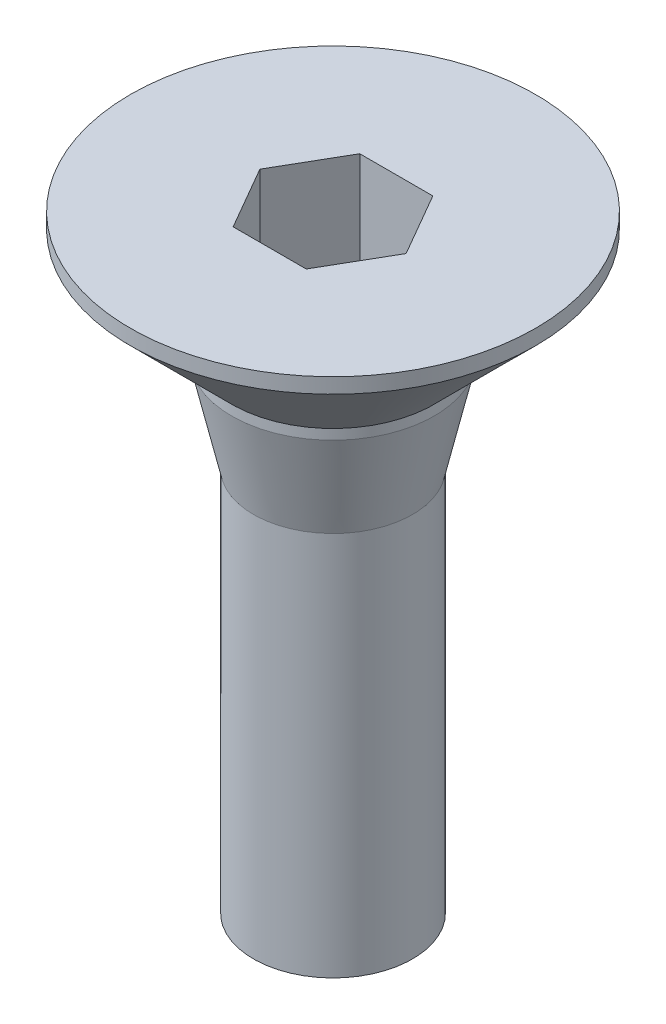
ISO-10303-21;
HEADER;
FILE_DESCRIPTION(('STEP AP214'),'2;1');
FILE_NAME('part.step','',(''),(''),'','','');
FILE_SCHEMA(('AUTOMOTIVE_DESIGN { 1 0 10303 214 1 1 1 1 }'));
ENDSEC;
DATA;
#1=APPLICATION_CONTEXT('core data for automotive mechanical design processes');
#2=APPLICATION_PROTOCOL_DEFINITION('international standard','automotive_design',2000,#1);
#3=PRODUCT_CONTEXT('',#1,'mechanical');
#4=PRODUCT('Part','Part','',(#3));
#5=PRODUCT_RELATED_PRODUCT_CATEGORY('part','',(#4));
#6=PRODUCT_DEFINITION_FORMATION('','',#4);
#7=PRODUCT_DEFINITION_CONTEXT('part definition',#1,'design');
#8=PRODUCT_DEFINITION('design','',#6,#7);
#9=PRODUCT_DEFINITION_SHAPE('','',#8);
#10=(LENGTH_UNIT() NAMED_UNIT(*) SI_UNIT(.MILLI.,.METRE.));
#11=(NAMED_UNIT(*) PLANE_ANGLE_UNIT() SI_UNIT($,.RADIAN.));
#12=(NAMED_UNIT(*) SI_UNIT($,.STERADIAN.) SOLID_ANGLE_UNIT());
#13=UNCERTAINTY_MEASURE_WITH_UNIT(LENGTH_MEASURE(1.E-05),#10,'distance_accuracy_value','');
#14=(GEOMETRIC_REPRESENTATION_CONTEXT(3) GLOBAL_UNCERTAINTY_ASSIGNED_CONTEXT((#13)) GLOBAL_UNIT_ASSIGNED_CONTEXT((#10,
#11,#12)) REPRESENTATION_CONTEXT('',''));
#15=CARTESIAN_POINT('',(0.,0.,0.));
#16=DIRECTION('',(0.,0.,1.));
#17=DIRECTION('',(1.,0.,0.));
#18=AXIS2_PLACEMENT_3D('',#15,#16,#17);
#19=CARTESIAN_POINT('',(0.,0.,0.));
#20=DIRECTION('',(0.,-1.,0.));
#21=DIRECTION('',(1.,0.,0.));
#22=AXIS2_PLACEMENT_3D('',#19,#20,#21);
#23=PLANE('',#22);
#24=DIRECTION('',(1.,0.,0.));
#25=VECTOR('',#24,1.);
#26=CARTESIAN_POINT('',(-0.721687836487031,0.,1.25));
#27=LINE('',#26,#25);
#28=CARTESIAN_POINT('',(-0.721687836487031,0.,1.25));
#29=VERTEX_POINT('',#28);
#30=CARTESIAN_POINT('',(0.721687836487031,0.,1.25));
#31=VERTEX_POINT('',#30);
#32=EDGE_CURVE('E121',#29,#31,#27,.T.);
#33=ORIENTED_EDGE('',*,*,#32,.F.);
#34=DIRECTION('',(0.499999999999998,0.,0.86602540378444));
#35=VECTOR('',#34,1.);
#36=CARTESIAN_POINT('',(-0.721687836487031,0.,1.25));
#37=LINE('',#36,#35);
#38=CARTESIAN_POINT('',(-1.44337567297406,0.,0.));
#39=VERTEX_POINT('',#38);
#40=EDGE_CURVE('E47',#39,#29,#37,.T.);
#41=ORIENTED_EDGE('',*,*,#40,.F.);
#42=DIRECTION('',(-0.499999999999998,0.,0.86602540378444));
#43=VECTOR('',#42,1.);
#44=CARTESIAN_POINT('',(-0.721687836487031,0.,-1.25));
#45=LINE('',#44,#43);
#46=CARTESIAN_POINT('',(-0.721687836487031,0.,-1.25));
#47=VERTEX_POINT('',#46);
#48=EDGE_CURVE('E130',#47,#39,#45,.T.);
#49=ORIENTED_EDGE('',*,*,#48,.F.);
#50=DIRECTION('',(-1.,0.,0.));
#51=VECTOR('',#50,1.);
#52=CARTESIAN_POINT('',(-0.721687836487031,0.,-1.25));
#53=LINE('',#52,#51);
#54=CARTESIAN_POINT('',(0.721687836487031,0.,-1.25));
#55=VERTEX_POINT('',#54);
#56=EDGE_CURVE('E128',#55,#47,#53,.T.);
#57=ORIENTED_EDGE('',*,*,#56,.F.);
#58=DIRECTION('',(-0.499999999999998,0.,-0.86602540378444));
#59=VECTOR('',#58,1.);
#60=CARTESIAN_POINT('',(0.721687836487031,0.,-1.25));
#61=LINE('',#60,#59);
#62=CARTESIAN_POINT('',(1.44337567297406,0.,0.));
#63=VERTEX_POINT('',#62);
#64=EDGE_CURVE('E95',#63,#55,#61,.T.);
#65=ORIENTED_EDGE('',*,*,#64,.F.);
#66=DIRECTION('',(0.499999999999998,0.,-0.86602540378444));
#67=VECTOR('',#66,1.);
#68=CARTESIAN_POINT('',(0.721687836487031,0.,1.25));
#69=LINE('',#68,#67);
#70=EDGE_CURVE('E124',#31,#63,#69,.T.);
#71=ORIENTED_EDGE('',*,*,#70,.F.);
#72=EDGE_LOOP('',(#33,#41,#49,#57,#65,#71));
#73=FACE_BOUND('',#72,.T.);
#74=CARTESIAN_POINT('',(0.,0.,0.));
#75=DIRECTION('',(0.,1.,0.));
#76=DIRECTION('',(-1.,0.,0.));
#77=AXIS2_PLACEMENT_3D('',#74,#75,#76);
#78=CIRCLE('',#77,4.);
#79=CARTESIAN_POINT('',(-4.,0.,0.));
#80=VERTEX_POINT('',#79);
#81=EDGE_CURVE('E11',#80,#80,#78,.T.);
#82=ORIENTED_EDGE('',*,*,#81,.T.);
#83=EDGE_LOOP('',(#82));
#84=FACE_BOUND('',#83,.T.);
#85=ADVANCED_FACE('F33',(#73,#84),#23,.F.);
#86=CARTESIAN_POINT('',(0.,0.,0.));
#87=DIRECTION('',(0.,1.,0.));
#88=DIRECTION('',(-1.,0.,0.));
#89=AXIS2_PLACEMENT_3D('',#86,#87,#88);
#90=CYLINDRICAL_SURFACE('',#89,4.);
#91=ORIENTED_EDGE('',*,*,#81,.F.);
#92=EDGE_LOOP('',(#91));
#93=FACE_BOUND('',#92,.T.);
#94=CARTESIAN_POINT('',(0.,-0.299999999999975,0.));
#95=DIRECTION('',(0.,1.,0.));
#96=DIRECTION('',(-1.,0.,0.));
#97=AXIS2_PLACEMENT_3D('',#94,#95,#96);
#98=CIRCLE('',#97,4.);
#99=CARTESIAN_POINT('',(-4.,-0.299999999999976,0.));
#100=VERTEX_POINT('',#99);
#101=EDGE_CURVE('E40',#100,#100,#98,.T.);
#102=ORIENTED_EDGE('',*,*,#101,.T.);
#103=EDGE_LOOP('',(#102));
#104=FACE_BOUND('',#103,.T.);
#105=ADVANCED_FACE('F153',(#93,#104),#90,.T.);
#106=CARTESIAN_POINT('',(0.,-2.3,0.));
#107=DIRECTION('',(0.,1.,0.));
#108=DIRECTION('',(-1.,0.,0.));
#109=AXIS2_PLACEMENT_3D('',#106,#107,#108);
#110=CONICAL_SURFACE('',#109,2.,0.785398163397442);
#111=ORIENTED_EDGE('',*,*,#101,.F.);
#112=EDGE_LOOP('',(#111));
#113=FACE_BOUND('',#112,.T.);
#114=CARTESIAN_POINT('',(0.,-2.3,0.));
#115=DIRECTION('',(0.,1.,0.));
#116=DIRECTION('',(-1.,0.,0.));
#117=AXIS2_PLACEMENT_3D('',#114,#115,#116);
#118=CIRCLE('',#117,2.);
#119=CARTESIAN_POINT('',(-2.,-2.3,0.));
#120=VERTEX_POINT('',#119);
#121=EDGE_CURVE('E148',#120,#120,#118,.T.);
#122=ORIENTED_EDGE('',*,*,#121,.T.);
#123=EDGE_LOOP('',(#122));
#124=FACE_BOUND('',#123,.T.);
#125=ADVANCED_FACE('F155',(#113,#124),#110,.T.);
#126=CARTESIAN_POINT('',(0.,0.,0.));
#127=DIRECTION('',(0.,1.,0.));
#128=DIRECTION('',(-1.,0.,0.));
#129=AXIS2_PLACEMENT_3D('',#126,#127,#128);
#130=CYLINDRICAL_SURFACE('',#129,2.);
#131=ORIENTED_EDGE('',*,*,#121,.F.);
#132=EDGE_LOOP('',(#131));
#133=FACE_BOUND('',#132,.T.);
#134=CARTESIAN_POINT('',(0.,-2.5,0.));
#135=DIRECTION('',(0.,1.,0.));
#136=DIRECTION('',(-1.,0.,0.));
#137=AXIS2_PLACEMENT_3D('',#134,#135,#136);
#138=CIRCLE('',#137,2.);
#139=CARTESIAN_POINT('',(-2.,-2.5,0.));
#140=VERTEX_POINT('',#139);
#141=EDGE_CURVE('E145',#140,#140,#138,.T.);
#142=ORIENTED_EDGE('',*,*,#141,.T.);
#143=EDGE_LOOP('',(#142));
#144=FACE_BOUND('',#143,.T.);
#145=ADVANCED_FACE('F158',(#133,#144),#130,.T.);
#146=CARTESIAN_POINT('',(0.,-4.4,0.));
#147=DIRECTION('',(0.,1.,0.));
#148=DIRECTION('',(-1.,0.,0.));
#149=AXIS2_PLACEMENT_3D('',#146,#147,#148);
#150=CONICAL_SURFACE('',#149,1.5705,0.222316126094133);
#151=ORIENTED_EDGE('',*,*,#141,.F.);
#152=EDGE_LOOP('',(#151));
#153=FACE_BOUND('',#152,.T.);
#154=CARTESIAN_POINT('',(0.,-4.4,0.));
#155=DIRECTION('',(0.,1.,0.));
#156=DIRECTION('',(-1.,0.,0.));
#157=AXIS2_PLACEMENT_3D('',#154,#155,#156);
#158=CIRCLE('',#157,1.5705);
#159=CARTESIAN_POINT('',(-1.5705,-4.4,0.));
#160=VERTEX_POINT('',#159);
#161=EDGE_CURVE('E142',#160,#160,#158,.T.);
#162=ORIENTED_EDGE('',*,*,#161,.T.);
#163=EDGE_LOOP('',(#162));
#164=FACE_BOUND('',#163,.T.);
#165=ADVANCED_FACE('F164',(#153,#164),#150,.T.);
#166=CARTESIAN_POINT('',(0.,0.,0.));
#167=DIRECTION('',(0.,1.,0.));
#168=DIRECTION('',(-1.,0.,0.));
#169=AXIS2_PLACEMENT_3D('',#166,#167,#168);
#170=CYLINDRICAL_SURFACE('',#169,1.5705);
#171=ORIENTED_EDGE('',*,*,#161,.F.);
#172=EDGE_LOOP('',(#171));
#173=FACE_BOUND('',#172,.T.);
#174=CARTESIAN_POINT('',(0.,-12.,0.));
#175=DIRECTION('',(0.,1.,0.));
#176=DIRECTION('',(-1.,0.,0.));
#177=AXIS2_PLACEMENT_3D('',#174,#175,#176);
#178=CIRCLE('',#177,1.5705);
#179=CARTESIAN_POINT('',(-1.5705,-12.,0.));
#180=VERTEX_POINT('',#179);
#181=EDGE_CURVE('E134',#180,#180,#178,.T.);
#182=ORIENTED_EDGE('',*,*,#181,.T.);
#183=EDGE_LOOP('',(#182));
#184=FACE_BOUND('',#183,.T.);
#185=ADVANCED_FACE('F170',(#173,#184),#170,.T.);
#186=CARTESIAN_POINT('',(1.5705,-12.,0.));
#187=DIRECTION('',(0.,1.,0.));
#188=DIRECTION('',(-1.,0.,0.));
#189=AXIS2_PLACEMENT_3D('',#186,#187,#188);
#190=PLANE('',#189);
#191=ORIENTED_EDGE('',*,*,#181,.F.);
#192=EDGE_LOOP('',(#191));
#193=FACE_BOUND('',#192,.T.);
#194=ADVANCED_FACE('F176',(#193),#190,.F.);
#195=CARTESIAN_POINT('',(-0.721687836487031,-5.3,1.25));
#196=DIRECTION('',(-0.86602540378444,0.,0.499999999999998));
#197=DIRECTION('',(0.499999999999998,0.,0.86602540378444));
#198=AXIS2_PLACEMENT_3D('',#195,#196,#197);
#199=PLANE('',#198);
#200=ORIENTED_EDGE('',*,*,#40,.T.);
#201=DIRECTION('',(0.,1.,0.));
#202=VECTOR('',#201,1.);
#203=CARTESIAN_POINT('',(-0.721687836487031,-5.3,1.25));
#204=LINE('',#203,#202);
#205=CARTESIAN_POINT('',(-0.721687836487031,-5.3,1.25));
#206=VERTEX_POINT('',#205);
#207=EDGE_CURVE('E77',#206,#29,#204,.T.);
#208=ORIENTED_EDGE('',*,*,#207,.F.);
#209=DIRECTION('',(0.499999999999998,0.,0.86602540378444));
#210=VECTOR('',#209,1.);
#211=CARTESIAN_POINT('',(-0.721687836487031,-5.3,1.25));
#212=LINE('',#211,#210);
#213=CARTESIAN_POINT('',(-1.44337567297406,-5.3,0.));
#214=VERTEX_POINT('',#213);
#215=EDGE_CURVE('E132',#214,#206,#212,.T.);
#216=ORIENTED_EDGE('',*,*,#215,.F.);
#217=DIRECTION('',(0.,1.,0.));
#218=VECTOR('',#217,1.);
#219=CARTESIAN_POINT('',(-1.44337567297406,-5.3,0.));
#220=LINE('',#219,#218);
#221=EDGE_CURVE('E55',#214,#39,#220,.T.);
#222=ORIENTED_EDGE('',*,*,#221,.T.);
#223=EDGE_LOOP('',(#200,#208,#216,#222));
#224=FACE_BOUND('',#223,.T.);
#225=ADVANCED_FACE('F181',(#224),#199,.F.);
#226=CARTESIAN_POINT('',(-0.721687836487031,-5.3,-1.25));
#227=DIRECTION('',(-0.86602540378444,0.,-0.499999999999998));
#228=DIRECTION('',(-0.499999999999998,0.,0.86602540378444));
#229=AXIS2_PLACEMENT_3D('',#226,#227,#228);
#230=PLANE('',#229);
#231=ORIENTED_EDGE('',*,*,#48,.T.);
#232=ORIENTED_EDGE('',*,*,#221,.F.);
#233=DIRECTION('',(-0.499999999999998,0.,0.86602540378444));
#234=VECTOR('',#233,1.);
#235=CARTESIAN_POINT('',(-0.721687836487031,-5.3,-1.25));
#236=LINE('',#235,#234);
#237=CARTESIAN_POINT('',(-0.721687836487031,-5.3,-1.25));
#238=VERTEX_POINT('',#237);
#239=EDGE_CURVE('E107',#238,#214,#236,.T.);
#240=ORIENTED_EDGE('',*,*,#239,.F.);
#241=DIRECTION('',(0.,1.,0.));
#242=VECTOR('',#241,1.);
#243=CARTESIAN_POINT('',(-0.721687836487031,-5.3,-1.25));
#244=LINE('',#243,#242);
#245=EDGE_CURVE('E99',#238,#47,#244,.T.);
#246=ORIENTED_EDGE('',*,*,#245,.T.);
#247=EDGE_LOOP('',(#231,#232,#240,#246));
#248=FACE_BOUND('',#247,.T.);
#249=ADVANCED_FACE('F186',(#248),#230,.F.);
#250=CARTESIAN_POINT('',(-0.721687836487031,-5.3,-1.25));
#251=DIRECTION('',(0.,0.,-1.));
#252=DIRECTION('',(-1.,0.,0.));
#253=AXIS2_PLACEMENT_3D('',#250,#251,#252);
#254=PLANE('',#253);
#255=ORIENTED_EDGE('',*,*,#56,.T.);
#256=ORIENTED_EDGE('',*,*,#245,.F.);
#257=DIRECTION('',(-1.,0.,0.));
#258=VECTOR('',#257,1.);
#259=CARTESIAN_POINT('',(-0.721687836487031,-5.3,-1.25));
#260=LINE('',#259,#258);
#261=CARTESIAN_POINT('',(0.721687836487031,-5.3,-1.25));
#262=VERTEX_POINT('',#261);
#263=EDGE_CURVE('E103',#262,#238,#260,.T.);
#264=ORIENTED_EDGE('',*,*,#263,.F.);
#265=DIRECTION('',(0.,1.,0.));
#266=VECTOR('',#265,1.);
#267=CARTESIAN_POINT('',(0.721687836487031,-5.3,-1.25));
#268=LINE('',#267,#266);
#269=EDGE_CURVE('E88',#262,#55,#268,.T.);
#270=ORIENTED_EDGE('',*,*,#269,.T.);
#271=EDGE_LOOP('',(#255,#256,#264,#270));
#272=FACE_BOUND('',#271,.T.);
#273=ADVANCED_FACE('F104',(#272),#254,.F.);
#274=CARTESIAN_POINT('',(0.721687836487031,-5.3,-1.25));
#275=DIRECTION('',(0.86602540378444,0.,-0.499999999999998));
#276=DIRECTION('',(-0.499999999999998,0.,-0.86602540378444));
#277=AXIS2_PLACEMENT_3D('',#274,#275,#276);
#278=PLANE('',#277);
#279=ORIENTED_EDGE('',*,*,#64,.T.);
#280=ORIENTED_EDGE('',*,*,#269,.F.);
#281=DIRECTION('',(-0.499999999999998,0.,-0.86602540378444));
#282=VECTOR('',#281,1.);
#283=CARTESIAN_POINT('',(0.721687836487031,-5.3,-1.25));
#284=LINE('',#283,#282);
#285=CARTESIAN_POINT('',(1.44337567297406,-5.3,0.));
#286=VERTEX_POINT('',#285);
#287=EDGE_CURVE('E92',#286,#262,#284,.T.);
#288=ORIENTED_EDGE('',*,*,#287,.F.);
#289=DIRECTION('',(0.,1.,0.));
#290=VECTOR('',#289,1.);
#291=CARTESIAN_POINT('',(1.44337567297406,-5.3,0.));
#292=LINE('',#291,#290);
#293=EDGE_CURVE('E100',#286,#63,#292,.T.);
#294=ORIENTED_EDGE('',*,*,#293,.T.);
#295=EDGE_LOOP('',(#279,#280,#288,#294));
#296=FACE_BOUND('',#295,.T.);
#297=ADVANCED_FACE('F90',(#296),#278,.F.);
#298=CARTESIAN_POINT('',(0.721687836487031,-5.3,1.25));
#299=DIRECTION('',(0.86602540378444,0.,0.499999999999998));
#300=DIRECTION('',(0.499999999999998,0.,-0.86602540378444));
#301=AXIS2_PLACEMENT_3D('',#298,#299,#300);
#302=PLANE('',#301);
#303=ORIENTED_EDGE('',*,*,#70,.T.);
#304=ORIENTED_EDGE('',*,*,#293,.F.);
#305=DIRECTION('',(0.499999999999998,0.,-0.86602540378444));
#306=VECTOR('',#305,1.);
#307=CARTESIAN_POINT('',(0.721687836487031,-5.3,1.25));
#308=LINE('',#307,#306);
#309=CARTESIAN_POINT('',(0.721687836487031,-5.3,1.25));
#310=VERTEX_POINT('',#309);
#311=EDGE_CURVE('E113',#310,#286,#308,.T.);
#312=ORIENTED_EDGE('',*,*,#311,.F.);
#313=DIRECTION('',(0.,1.,0.));
#314=VECTOR('',#313,1.);
#315=CARTESIAN_POINT('',(0.721687836487031,-5.3,1.25));
#316=LINE('',#315,#314);
#317=EDGE_CURVE('E137',#310,#31,#316,.T.);
#318=ORIENTED_EDGE('',*,*,#317,.T.);
#319=EDGE_LOOP('',(#303,#304,#312,#318));
#320=FACE_BOUND('',#319,.T.);
#321=ADVANCED_FACE('F212',(#320),#302,.F.);
#322=CARTESIAN_POINT('',(-0.721687836487031,-5.3,1.25));
#323=DIRECTION('',(0.,0.,1.));
#324=DIRECTION('',(1.,0.,0.));
#325=AXIS2_PLACEMENT_3D('',#322,#323,#324);
#326=PLANE('',#325);
#327=ORIENTED_EDGE('',*,*,#32,.T.);
#328=ORIENTED_EDGE('',*,*,#317,.F.);
#329=DIRECTION('',(1.,0.,0.));
#330=VECTOR('',#329,1.);
#331=CARTESIAN_POINT('',(-0.721687836487031,-5.3,1.25));
#332=LINE('',#331,#330);
#333=EDGE_CURVE('E115',#206,#310,#332,.T.);
#334=ORIENTED_EDGE('',*,*,#333,.F.);
#335=ORIENTED_EDGE('',*,*,#207,.T.);
#336=EDGE_LOOP('',(#327,#328,#334,#335));
#337=FACE_BOUND('',#336,.T.);
#338=ADVANCED_FACE('F200',(#337),#326,.F.);
#339=CARTESIAN_POINT('',(-0.721687836487031,-5.3,1.25));
#340=DIRECTION('',(0.,-1.,0.));
#341=DIRECTION('',(0.,0.,-1.));
#342=AXIS2_PLACEMENT_3D('',#339,#340,#341);
#343=PLANE('',#342);
#344=ORIENTED_EDGE('',*,*,#215,.T.);
#345=ORIENTED_EDGE('',*,*,#333,.T.);
#346=ORIENTED_EDGE('',*,*,#311,.T.);
#347=ORIENTED_EDGE('',*,*,#287,.T.);
#348=ORIENTED_EDGE('',*,*,#263,.T.);
#349=ORIENTED_EDGE('',*,*,#239,.T.);
#350=EDGE_LOOP('',(#344,#345,#346,#347,#348,#349));
#351=FACE_BOUND('',#350,.T.);
#352=ADVANCED_FACE('F110',(#351),#343,.F.);
#353=CLOSED_SHELL('',(#85,#105,#125,#145,#165,#185,#194,#225,#249,#273,#297,#321,#338,#352));
#354=MANIFOLD_SOLID_BREP('B2',#353);
#355=ADVANCED_BREP_SHAPE_REPRESENTATION('',(#18,#354),#14);
#356=SHAPE_DEFINITION_REPRESENTATION(#9,#355);
ENDSEC;
END-ISO-10303-21;
